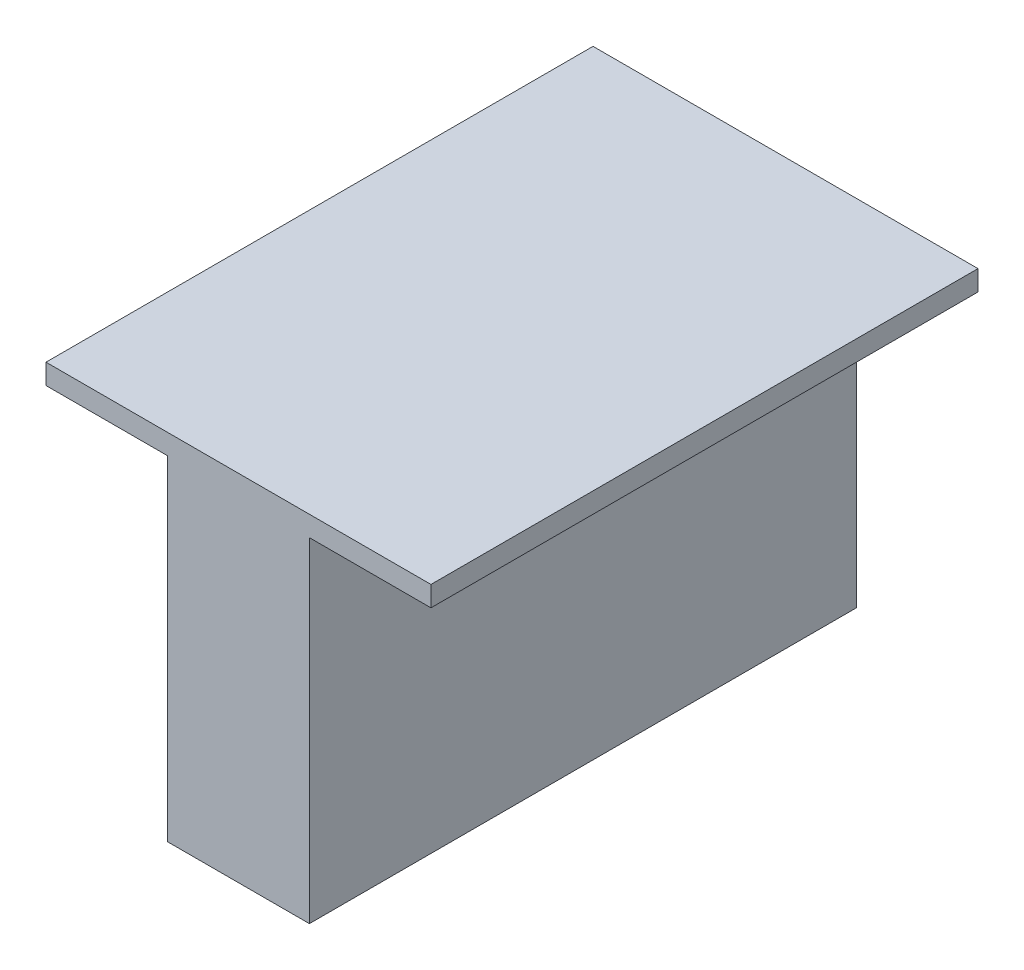
ISO-10303-21;
HEADER;
FILE_DESCRIPTION(('STEP AP214'),'2;1');
FILE_NAME('part.step','',(''),(''),'','','');
FILE_SCHEMA(('AUTOMOTIVE_DESIGN { 1 0 10303 214 1 1 1 1 }'));
ENDSEC;
DATA;
#1=APPLICATION_CONTEXT('core data for automotive mechanical design processes');
#2=APPLICATION_PROTOCOL_DEFINITION('international standard','automotive_design',2000,#1);
#3=PRODUCT_CONTEXT('',#1,'mechanical');
#4=PRODUCT('Part','Part','',(#3));
#5=PRODUCT_RELATED_PRODUCT_CATEGORY('part','',(#4));
#6=PRODUCT_DEFINITION_FORMATION('','',#4);
#7=PRODUCT_DEFINITION_CONTEXT('part definition',#1,'design');
#8=PRODUCT_DEFINITION('design','',#6,#7);
#9=PRODUCT_DEFINITION_SHAPE('','',#8);
#10=(LENGTH_UNIT() NAMED_UNIT(*) SI_UNIT(.MILLI.,.METRE.));
#11=(NAMED_UNIT(*) PLANE_ANGLE_UNIT() SI_UNIT($,.RADIAN.));
#12=(NAMED_UNIT(*) SI_UNIT($,.STERADIAN.) SOLID_ANGLE_UNIT());
#13=UNCERTAINTY_MEASURE_WITH_UNIT(LENGTH_MEASURE(1.E-05),#10,'distance_accuracy_value','');
#14=(GEOMETRIC_REPRESENTATION_CONTEXT(3) GLOBAL_UNCERTAINTY_ASSIGNED_CONTEXT((#13)) GLOBAL_UNIT_ASSIGNED_CONTEXT((#10,
#11,#12)) REPRESENTATION_CONTEXT('',''));
#15=CARTESIAN_POINT('',(0.,0.,0.));
#16=DIRECTION('',(0.,0.,1.));
#17=DIRECTION('',(1.,0.,0.));
#18=AXIS2_PLACEMENT_3D('',#15,#16,#17);
#19=CARTESIAN_POINT('',(14.,35.,0.));
#20=DIRECTION('',(-1.,0.,0.));
#21=DIRECTION('',(0.,0.,1.));
#22=AXIS2_PLACEMENT_3D('',#19,#20,#21);
#23=PLANE('',#22);
#24=DIRECTION('',(0.,0.,-1.));
#25=VECTOR('',#24,1.);
#26=CARTESIAN_POINT('',(14.,33.,0.));
#27=LINE('',#26,#25);
#28=CARTESIAN_POINT('',(14.,33.,0.));
#29=VERTEX_POINT('',#28);
#30=CARTESIAN_POINT('',(14.,33.,-54.));
#31=VERTEX_POINT('',#30);
#32=EDGE_CURVE('E54',#29,#31,#27,.T.);
#33=ORIENTED_EDGE('',*,*,#32,.F.);
#34=DIRECTION('',(0.,-1.,0.));
#35=VECTOR('',#34,1.);
#36=CARTESIAN_POINT('',(14.,35.,0.));
#37=LINE('',#36,#35);
#38=CARTESIAN_POINT('',(14.,0.,0.));
#39=VERTEX_POINT('',#38);
#40=EDGE_CURVE('E47',#29,#39,#37,.T.);
#41=ORIENTED_EDGE('',*,*,#40,.T.);
#42=DIRECTION('',(0.,0.,-1.));
#43=VECTOR('',#42,1.);
#44=CARTESIAN_POINT('',(14.,0.,0.));
#45=LINE('',#44,#43);
#46=CARTESIAN_POINT('',(14.,0.,-54.));
#47=VERTEX_POINT('',#46);
#48=EDGE_CURVE('E215',#39,#47,#45,.T.);
#49=ORIENTED_EDGE('',*,*,#48,.T.);
#50=DIRECTION('',(0.,-1.,0.));
#51=VECTOR('',#50,1.);
#52=CARTESIAN_POINT('',(14.,35.,-54.));
#53=LINE('',#52,#51);
#54=EDGE_CURVE('E221',#31,#47,#53,.T.);
#55=ORIENTED_EDGE('',*,*,#54,.F.);
#56=EDGE_LOOP('',(#33,#41,#49,#55));
#57=FACE_BOUND('',#56,.T.);
#58=ADVANCED_FACE('F39',(#57),#23,.F.);
#59=CARTESIAN_POINT('',(0.,35.,0.));
#60=DIRECTION('',(1.,0.,0.));
#61=DIRECTION('',(0.,0.,-1.));
#62=AXIS2_PLACEMENT_3D('',#59,#60,#61);
#63=PLANE('',#62);
#64=DIRECTION('',(0.,0.,1.));
#65=VECTOR('',#64,1.);
#66=CARTESIAN_POINT('',(0.,33.,-54.));
#67=LINE('',#66,#65);
#68=CARTESIAN_POINT('',(0.,33.,-54.));
#69=VERTEX_POINT('',#68);
#70=CARTESIAN_POINT('',(0.,33.,0.));
#71=VERTEX_POINT('',#70);
#72=EDGE_CURVE('E62',#69,#71,#67,.T.);
#73=ORIENTED_EDGE('',*,*,#72,.F.);
#74=DIRECTION('',(0.,-1.,0.));
#75=VECTOR('',#74,1.);
#76=CARTESIAN_POINT('',(0.,35.,-54.));
#77=LINE('',#76,#75);
#78=CARTESIAN_POINT('',(0.,0.,-54.));
#79=VERTEX_POINT('',#78);
#80=EDGE_CURVE('E210',#69,#79,#77,.T.);
#81=ORIENTED_EDGE('',*,*,#80,.T.);
#82=DIRECTION('',(0.,0.,1.));
#83=VECTOR('',#82,1.);
#84=CARTESIAN_POINT('',(0.,0.,0.));
#85=LINE('',#84,#83);
#86=CARTESIAN_POINT('',(0.,0.,0.));
#87=VERTEX_POINT('',#86);
#88=EDGE_CURVE('E181',#79,#87,#85,.T.);
#89=ORIENTED_EDGE('',*,*,#88,.T.);
#90=DIRECTION('',(0.,-1.,0.));
#91=VECTOR('',#90,1.);
#92=CARTESIAN_POINT('',(0.,35.,0.));
#93=LINE('',#92,#91);
#94=EDGE_CURVE('E11',#71,#87,#93,.T.);
#95=ORIENTED_EDGE('',*,*,#94,.F.);
#96=EDGE_LOOP('',(#73,#81,#89,#95));
#97=FACE_BOUND('',#96,.T.);
#98=ADVANCED_FACE('F41',(#97),#63,.F.);
#99=CARTESIAN_POINT('',(0.,0.,0.));
#100=DIRECTION('',(0.,-1.,0.));
#101=DIRECTION('',(0.,0.,-1.));
#102=AXIS2_PLACEMENT_3D('',#99,#100,#101);
#103=PLANE('',#102);
#104=ORIENTED_EDGE('',*,*,#88,.F.);
#105=DIRECTION('',(-1.,0.,0.));
#106=VECTOR('',#105,1.);
#107=CARTESIAN_POINT('',(0.,0.,-54.));
#108=LINE('',#107,#106);
#109=EDGE_CURVE('E138',#47,#79,#108,.T.);
#110=ORIENTED_EDGE('',*,*,#109,.F.);
#111=ORIENTED_EDGE('',*,*,#48,.F.);
#112=DIRECTION('',(1.,0.,0.));
#113=VECTOR('',#112,1.);
#114=CARTESIAN_POINT('',(0.,0.,0.));
#115=LINE('',#114,#113);
#116=EDGE_CURVE('E213',#87,#39,#115,.T.);
#117=ORIENTED_EDGE('',*,*,#116,.F.);
#118=EDGE_LOOP('',(#104,#110,#111,#117));
#119=FACE_BOUND('',#118,.T.);
#120=DIRECTION('',(-1.,0.,0.));
#121=VECTOR('',#120,1.);
#122=CARTESIAN_POINT('',(0.,0.,-49.));
#123=LINE('',#122,#121);
#124=CARTESIAN_POINT('',(9.,0.,-49.));
#125=VERTEX_POINT('',#124);
#126=CARTESIAN_POINT('',(5.,0.,-49.));
#127=VERTEX_POINT('',#126);
#128=EDGE_CURVE('E187',#125,#127,#123,.T.);
#129=ORIENTED_EDGE('',*,*,#128,.T.);
#130=DIRECTION('',(0.,0.,1.));
#131=VECTOR('',#130,1.);
#132=CARTESIAN_POINT('',(5.,0.,0.));
#133=LINE('',#132,#131);
#134=CARTESIAN_POINT('',(5.,0.,-5.));
#135=VERTEX_POINT('',#134);
#136=EDGE_CURVE('E177',#127,#135,#133,.T.);
#137=ORIENTED_EDGE('',*,*,#136,.T.);
#138=DIRECTION('',(1.,0.,0.));
#139=VECTOR('',#138,1.);
#140=CARTESIAN_POINT('',(0.,0.,-5.));
#141=LINE('',#140,#139);
#142=CARTESIAN_POINT('',(9.,0.,-5.));
#143=VERTEX_POINT('',#142);
#144=EDGE_CURVE('E201',#135,#143,#141,.T.);
#145=ORIENTED_EDGE('',*,*,#144,.T.);
#146=DIRECTION('',(0.,0.,-1.));
#147=VECTOR('',#146,1.);
#148=CARTESIAN_POINT('',(9.,0.,0.));
#149=LINE('',#148,#147);
#150=EDGE_CURVE('E204',#143,#125,#149,.T.);
#151=ORIENTED_EDGE('',*,*,#150,.T.);
#152=EDGE_LOOP('',(#129,#137,#145,#151));
#153=FACE_BOUND('',#152,.T.);
#154=ADVANCED_FACE('F227',(#119,#153),#103,.T.);
#155=CARTESIAN_POINT('',(0.,35.,0.));
#156=DIRECTION('',(0.,0.,-1.));
#157=DIRECTION('',(-1.,0.,0.));
#158=AXIS2_PLACEMENT_3D('',#155,#156,#157);
#159=PLANE('',#158);
#160=ORIENTED_EDGE('',*,*,#116,.T.);
#161=ORIENTED_EDGE('',*,*,#40,.F.);
#162=DIRECTION('',(-1.,0.,0.));
#163=VECTOR('',#162,1.);
#164=CARTESIAN_POINT('',(26.,33.,0.));
#165=LINE('',#164,#163);
#166=CARTESIAN_POINT('',(26.,33.,0.));
#167=VERTEX_POINT('',#166);
#168=EDGE_CURVE('E145',#167,#29,#165,.T.);
#169=ORIENTED_EDGE('',*,*,#168,.F.);
#170=DIRECTION('',(0.,-1.,0.));
#171=VECTOR('',#170,1.);
#172=CARTESIAN_POINT('',(26.,35.,0.));
#173=LINE('',#172,#171);
#174=CARTESIAN_POINT('',(26.,35.,0.));
#175=VERTEX_POINT('',#174);
#176=EDGE_CURVE('E141',#175,#167,#173,.T.);
#177=ORIENTED_EDGE('',*,*,#176,.F.);
#178=DIRECTION('',(1.,0.,0.));
#179=VECTOR('',#178,1.);
#180=CARTESIAN_POINT('',(0.,35.,0.));
#181=LINE('',#180,#179);
#182=CARTESIAN_POINT('',(-12.,35.,0.));
#183=VERTEX_POINT('',#182);
#184=EDGE_CURVE('E127',#183,#175,#181,.T.);
#185=ORIENTED_EDGE('',*,*,#184,.F.);
#186=DIRECTION('',(0.,1.,0.));
#187=VECTOR('',#186,1.);
#188=CARTESIAN_POINT('',(-12.,33.,0.));
#189=LINE('',#188,#187);
#190=CARTESIAN_POINT('',(-12.,33.,0.));
#191=VERTEX_POINT('',#190);
#192=EDGE_CURVE('E168',#191,#183,#189,.T.);
#193=ORIENTED_EDGE('',*,*,#192,.F.);
#194=DIRECTION('',(1.,0.,0.));
#195=VECTOR('',#194,1.);
#196=CARTESIAN_POINT('',(-12.,33.,0.));
#197=LINE('',#196,#195);
#198=EDGE_CURVE('E170',#191,#71,#197,.T.);
#199=ORIENTED_EDGE('',*,*,#198,.T.);
#200=ORIENTED_EDGE('',*,*,#94,.T.);
#201=EDGE_LOOP('',(#160,#161,#169,#177,#185,#193,#199,#200));
#202=FACE_BOUND('',#201,.T.);
#203=ADVANCED_FACE('F143',(#202),#159,.F.);
#204=CARTESIAN_POINT('',(0.,35.,-54.));
#205=DIRECTION('',(0.,0.,1.));
#206=DIRECTION('',(1.,0.,0.));
#207=AXIS2_PLACEMENT_3D('',#204,#205,#206);
#208=PLANE('',#207);
#209=ORIENTED_EDGE('',*,*,#109,.T.);
#210=ORIENTED_EDGE('',*,*,#80,.F.);
#211=DIRECTION('',(1.,0.,0.));
#212=VECTOR('',#211,1.);
#213=CARTESIAN_POINT('',(-12.,33.,-54.));
#214=LINE('',#213,#212);
#215=CARTESIAN_POINT('',(-12.,33.,-54.));
#216=VERTEX_POINT('',#215);
#217=EDGE_CURVE('E174',#216,#69,#214,.T.);
#218=ORIENTED_EDGE('',*,*,#217,.F.);
#219=DIRECTION('',(0.,-1.,0.));
#220=VECTOR('',#219,1.);
#221=CARTESIAN_POINT('',(-12.,35.,-54.));
#222=LINE('',#221,#220);
#223=CARTESIAN_POINT('',(-12.,35.,-54.));
#224=VERTEX_POINT('',#223);
#225=EDGE_CURVE('E164',#224,#216,#222,.T.);
#226=ORIENTED_EDGE('',*,*,#225,.F.);
#227=DIRECTION('',(-1.,0.,0.));
#228=VECTOR('',#227,1.);
#229=CARTESIAN_POINT('',(0.,35.,-54.));
#230=LINE('',#229,#228);
#231=CARTESIAN_POINT('',(26.,35.,-54.));
#232=VERTEX_POINT('',#231);
#233=EDGE_CURVE('E137',#232,#224,#230,.T.);
#234=ORIENTED_EDGE('',*,*,#233,.F.);
#235=DIRECTION('',(0.,1.,0.));
#236=VECTOR('',#235,1.);
#237=CARTESIAN_POINT('',(26.,33.,-54.));
#238=LINE('',#237,#236);
#239=CARTESIAN_POINT('',(26.,33.,-54.));
#240=VERTEX_POINT('',#239);
#241=EDGE_CURVE('E153',#240,#232,#238,.T.);
#242=ORIENTED_EDGE('',*,*,#241,.F.);
#243=DIRECTION('',(-1.,0.,0.));
#244=VECTOR('',#243,1.);
#245=CARTESIAN_POINT('',(26.,33.,-54.));
#246=LINE('',#245,#244);
#247=EDGE_CURVE('E158',#240,#31,#246,.T.);
#248=ORIENTED_EDGE('',*,*,#247,.T.);
#249=ORIENTED_EDGE('',*,*,#54,.T.);
#250=EDGE_LOOP('',(#209,#210,#218,#226,#234,#242,#248,#249));
#251=FACE_BOUND('',#250,.T.);
#252=ADVANCED_FACE('F230',(#251),#208,.F.);
#253=CARTESIAN_POINT('',(0.,35.,0.));
#254=DIRECTION('',(0.,-1.,0.));
#255=DIRECTION('',(0.,0.,-1.));
#256=AXIS2_PLACEMENT_3D('',#253,#254,#255);
#257=PLANE('',#256);
#258=ORIENTED_EDGE('',*,*,#233,.T.);
#259=DIRECTION('',(0.,0.,-1.));
#260=VECTOR('',#259,1.);
#261=CARTESIAN_POINT('',(-12.,35.,0.));
#262=LINE('',#261,#260);
#263=EDGE_CURVE('E133',#183,#224,#262,.T.);
#264=ORIENTED_EDGE('',*,*,#263,.F.);
#265=ORIENTED_EDGE('',*,*,#184,.T.);
#266=DIRECTION('',(0.,0.,1.));
#267=VECTOR('',#266,1.);
#268=CARTESIAN_POINT('',(26.,35.,-54.));
#269=LINE('',#268,#267);
#270=EDGE_CURVE('E131',#232,#175,#269,.T.);
#271=ORIENTED_EDGE('',*,*,#270,.F.);
#272=EDGE_LOOP('',(#258,#264,#265,#271));
#273=FACE_BOUND('',#272,.T.);
#274=ADVANCED_FACE('F129',(#273),#257,.F.);
#275=CARTESIAN_POINT('',(5.,35.,0.));
#276=DIRECTION('',(1.,0.,0.));
#277=DIRECTION('',(0.,0.,-1.));
#278=AXIS2_PLACEMENT_3D('',#275,#276,#277);
#279=PLANE('',#278);
#280=ORIENTED_EDGE('',*,*,#136,.F.);
#281=DIRECTION('',(0.,-1.,0.));
#282=VECTOR('',#281,1.);
#283=CARTESIAN_POINT('',(5.,35.,-49.));
#284=LINE('',#283,#282);
#285=CARTESIAN_POINT('',(5.,30.,-49.));
#286=VERTEX_POINT('',#285);
#287=EDGE_CURVE('E188',#286,#127,#284,.T.);
#288=ORIENTED_EDGE('',*,*,#287,.F.);
#289=DIRECTION('',(0.,0.,1.));
#290=VECTOR('',#289,1.);
#291=CARTESIAN_POINT('',(5.,30.,0.));
#292=LINE('',#291,#290);
#293=CARTESIAN_POINT('',(5.,30.,-5.));
#294=VERTEX_POINT('',#293);
#295=EDGE_CURVE('E183',#286,#294,#292,.T.);
#296=ORIENTED_EDGE('',*,*,#295,.T.);
#297=DIRECTION('',(0.,-1.,0.));
#298=VECTOR('',#297,1.);
#299=CARTESIAN_POINT('',(5.,35.,-5.));
#300=LINE('',#299,#298);
#301=EDGE_CURVE('E178',#294,#135,#300,.T.);
#302=ORIENTED_EDGE('',*,*,#301,.T.);
#303=EDGE_LOOP('',(#280,#288,#296,#302));
#304=FACE_BOUND('',#303,.T.);
#305=ADVANCED_FACE('F270',(#304),#279,.T.);
#306=CARTESIAN_POINT('',(0.,35.,-5.));
#307=DIRECTION('',(0.,0.,-1.));
#308=DIRECTION('',(-1.,0.,0.));
#309=AXIS2_PLACEMENT_3D('',#306,#307,#308);
#310=PLANE('',#309);
#311=ORIENTED_EDGE('',*,*,#144,.F.);
#312=ORIENTED_EDGE('',*,*,#301,.F.);
#313=DIRECTION('',(1.,0.,0.));
#314=VECTOR('',#313,1.);
#315=CARTESIAN_POINT('',(0.,30.,-5.));
#316=LINE('',#315,#314);
#317=CARTESIAN_POINT('',(9.,30.,-5.));
#318=VERTEX_POINT('',#317);
#319=EDGE_CURVE('E186',#294,#318,#316,.T.);
#320=ORIENTED_EDGE('',*,*,#319,.T.);
#321=DIRECTION('',(0.,-1.,0.));
#322=VECTOR('',#321,1.);
#323=CARTESIAN_POINT('',(9.,35.,-5.));
#324=LINE('',#323,#322);
#325=EDGE_CURVE('E182',#318,#143,#324,.T.);
#326=ORIENTED_EDGE('',*,*,#325,.T.);
#327=EDGE_LOOP('',(#311,#312,#320,#326));
#328=FACE_BOUND('',#327,.T.);
#329=ADVANCED_FACE('F278',(#328),#310,.T.);
#330=CARTESIAN_POINT('',(9.,35.,0.));
#331=DIRECTION('',(-1.,0.,0.));
#332=DIRECTION('',(0.,0.,1.));
#333=AXIS2_PLACEMENT_3D('',#330,#331,#332);
#334=PLANE('',#333);
#335=ORIENTED_EDGE('',*,*,#150,.F.);
#336=ORIENTED_EDGE('',*,*,#325,.F.);
#337=DIRECTION('',(0.,0.,-1.));
#338=VECTOR('',#337,1.);
#339=CARTESIAN_POINT('',(9.,30.,0.));
#340=LINE('',#339,#338);
#341=CARTESIAN_POINT('',(9.,30.,-49.));
#342=VERTEX_POINT('',#341);
#343=EDGE_CURVE('E195',#318,#342,#340,.T.);
#344=ORIENTED_EDGE('',*,*,#343,.T.);
#345=DIRECTION('',(0.,-1.,0.));
#346=VECTOR('',#345,1.);
#347=CARTESIAN_POINT('',(9.,35.,-49.));
#348=LINE('',#347,#346);
#349=EDGE_CURVE('E190',#342,#125,#348,.T.);
#350=ORIENTED_EDGE('',*,*,#349,.T.);
#351=EDGE_LOOP('',(#335,#336,#344,#350));
#352=FACE_BOUND('',#351,.T.);
#353=ADVANCED_FACE('F274',(#352),#334,.T.);
#354=CARTESIAN_POINT('',(0.,35.,-49.));
#355=DIRECTION('',(0.,0.,1.));
#356=DIRECTION('',(1.,0.,0.));
#357=AXIS2_PLACEMENT_3D('',#354,#355,#356);
#358=PLANE('',#357);
#359=ORIENTED_EDGE('',*,*,#128,.F.);
#360=ORIENTED_EDGE('',*,*,#349,.F.);
#361=DIRECTION('',(-1.,0.,0.));
#362=VECTOR('',#361,1.);
#363=CARTESIAN_POINT('',(0.,30.,-49.));
#364=LINE('',#363,#362);
#365=EDGE_CURVE('E191',#342,#286,#364,.T.);
#366=ORIENTED_EDGE('',*,*,#365,.T.);
#367=ORIENTED_EDGE('',*,*,#287,.T.);
#368=EDGE_LOOP('',(#359,#360,#366,#367));
#369=FACE_BOUND('',#368,.T.);
#370=ADVANCED_FACE('F250',(#369),#358,.T.);
#371=CARTESIAN_POINT('',(0.,30.,0.));
#372=DIRECTION('',(0.,-1.,0.));
#373=DIRECTION('',(0.,0.,-1.));
#374=AXIS2_PLACEMENT_3D('',#371,#372,#373);
#375=PLANE('',#374);
#376=ORIENTED_EDGE('',*,*,#295,.F.);
#377=ORIENTED_EDGE('',*,*,#365,.F.);
#378=ORIENTED_EDGE('',*,*,#343,.F.);
#379=ORIENTED_EDGE('',*,*,#319,.F.);
#380=EDGE_LOOP('',(#376,#377,#378,#379));
#381=FACE_BOUND('',#380,.T.);
#382=ADVANCED_FACE('F243',(#381),#375,.T.);
#383=CARTESIAN_POINT('',(-12.,33.,-54.));
#384=DIRECTION('',(0.,1.,0.));
#385=DIRECTION('',(0.,0.,1.));
#386=AXIS2_PLACEMENT_3D('',#383,#384,#385);
#387=PLANE('',#386);
#388=ORIENTED_EDGE('',*,*,#72,.T.);
#389=ORIENTED_EDGE('',*,*,#198,.F.);
#390=DIRECTION('',(0.,0.,1.));
#391=VECTOR('',#390,1.);
#392=CARTESIAN_POINT('',(-12.,33.,-54.));
#393=LINE('',#392,#391);
#394=EDGE_CURVE('E166',#216,#191,#393,.T.);
#395=ORIENTED_EDGE('',*,*,#394,.F.);
#396=ORIENTED_EDGE('',*,*,#217,.T.);
#397=EDGE_LOOP('',(#388,#389,#395,#396));
#398=FACE_BOUND('',#397,.T.);
#399=ADVANCED_FACE('F241',(#398),#387,.F.);
#400=CARTESIAN_POINT('',(-12.,0.,0.));
#401=DIRECTION('',(-1.,0.,0.));
#402=DIRECTION('',(0.,0.,1.));
#403=AXIS2_PLACEMENT_3D('',#400,#401,#402);
#404=PLANE('',#403);
#405=ORIENTED_EDGE('',*,*,#263,.T.);
#406=ORIENTED_EDGE('',*,*,#225,.T.);
#407=ORIENTED_EDGE('',*,*,#394,.T.);
#408=ORIENTED_EDGE('',*,*,#192,.T.);
#409=EDGE_LOOP('',(#405,#406,#407,#408));
#410=FACE_BOUND('',#409,.T.);
#411=ADVANCED_FACE('F238',(#410),#404,.T.);
#412=CARTESIAN_POINT('',(26.,33.,0.));
#413=DIRECTION('',(0.,1.,0.));
#414=DIRECTION('',(0.,0.,1.));
#415=AXIS2_PLACEMENT_3D('',#412,#413,#414);
#416=PLANE('',#415);
#417=ORIENTED_EDGE('',*,*,#32,.T.);
#418=ORIENTED_EDGE('',*,*,#247,.F.);
#419=DIRECTION('',(0.,0.,-1.));
#420=VECTOR('',#419,1.);
#421=CARTESIAN_POINT('',(26.,33.,0.));
#422=LINE('',#421,#420);
#423=EDGE_CURVE('E148',#167,#240,#422,.T.);
#424=ORIENTED_EDGE('',*,*,#423,.F.);
#425=ORIENTED_EDGE('',*,*,#168,.T.);
#426=EDGE_LOOP('',(#417,#418,#424,#425));
#427=FACE_BOUND('',#426,.T.);
#428=ADVANCED_FACE('F234',(#427),#416,.F.);
#429=CARTESIAN_POINT('',(26.,0.,0.));
#430=DIRECTION('',(1.,0.,0.));
#431=DIRECTION('',(0.,0.,-1.));
#432=AXIS2_PLACEMENT_3D('',#429,#430,#431);
#433=PLANE('',#432);
#434=ORIENTED_EDGE('',*,*,#270,.T.);
#435=ORIENTED_EDGE('',*,*,#176,.T.);
#436=ORIENTED_EDGE('',*,*,#423,.T.);
#437=ORIENTED_EDGE('',*,*,#241,.T.);
#438=EDGE_LOOP('',(#434,#435,#436,#437));
#439=FACE_BOUND('',#438,.T.);
#440=ADVANCED_FACE('F151',(#439),#433,.T.);
#441=CLOSED_SHELL('',(#58,#98,#154,#203,#252,#274,#305,#329,#353,#370,#382,#399,#411,#428,#440));
#442=MANIFOLD_SOLID_BREP('B2',#441);
#443=ADVANCED_BREP_SHAPE_REPRESENTATION('',(#18,#442),#14);
#444=SHAPE_DEFINITION_REPRESENTATION(#9,#443);
ENDSEC;
END-ISO-10303-21;
